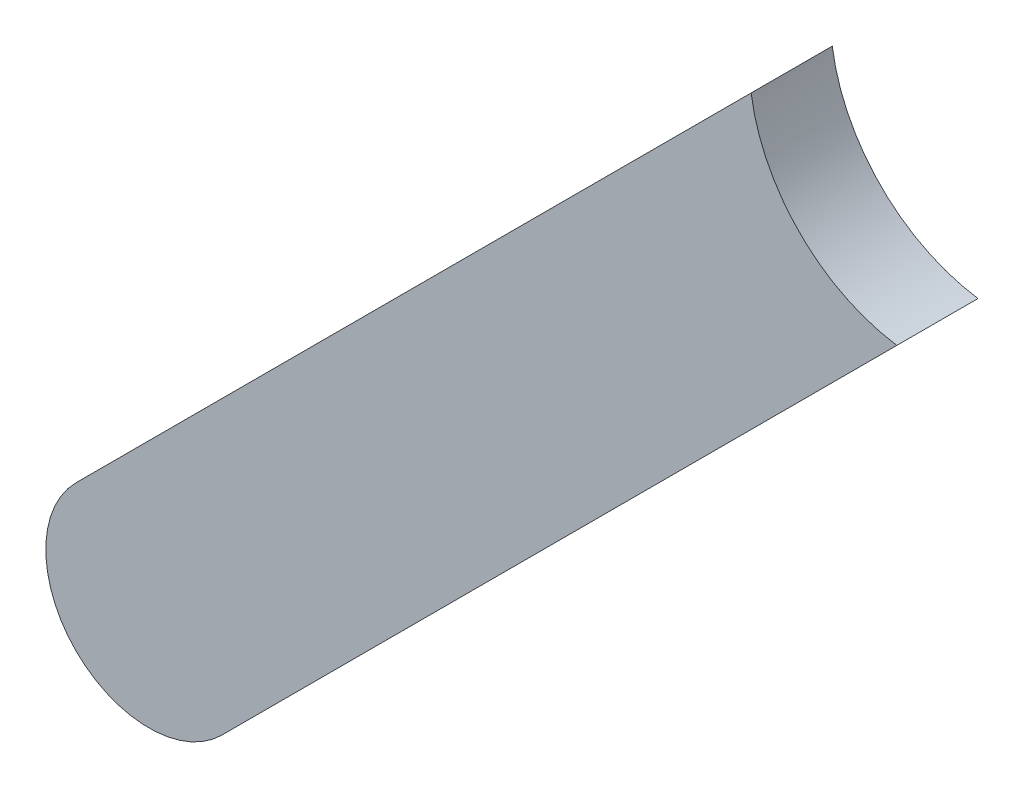
ISO-10303-21;
HEADER;
FILE_DESCRIPTION(('STEP AP214'),'2;1');
FILE_NAME('part.step','',(''),(''),'','','');
FILE_SCHEMA(('AUTOMOTIVE_DESIGN { 1 0 10303 214 1 1 1 1 }'));
ENDSEC;
DATA;
#1=APPLICATION_CONTEXT('core data for automotive mechanical design processes');
#2=APPLICATION_PROTOCOL_DEFINITION('international standard','automotive_design',2000,#1);
#3=PRODUCT_CONTEXT('',#1,'mechanical');
#4=PRODUCT('Part','Part','',(#3));
#5=PRODUCT_RELATED_PRODUCT_CATEGORY('part','',(#4));
#6=PRODUCT_DEFINITION_FORMATION('','',#4);
#7=PRODUCT_DEFINITION_CONTEXT('part definition',#1,'design');
#8=PRODUCT_DEFINITION('design','',#6,#7);
#9=PRODUCT_DEFINITION_SHAPE('','',#8);
#10=(LENGTH_UNIT() NAMED_UNIT(*) SI_UNIT(.MILLI.,.METRE.));
#11=(NAMED_UNIT(*) PLANE_ANGLE_UNIT() SI_UNIT($,.RADIAN.));
#12=(NAMED_UNIT(*) SI_UNIT($,.STERADIAN.) SOLID_ANGLE_UNIT());
#13=UNCERTAINTY_MEASURE_WITH_UNIT(LENGTH_MEASURE(1.E-05),#10,'distance_accuracy_value','');
#14=(GEOMETRIC_REPRESENTATION_CONTEXT(3) GLOBAL_UNCERTAINTY_ASSIGNED_CONTEXT((#13)) GLOBAL_UNIT_ASSIGNED_CONTEXT((#10,
#11,#12)) REPRESENTATION_CONTEXT('',''));
#15=CARTESIAN_POINT('',(0.,0.,0.));
#16=DIRECTION('',(0.,0.,1.));
#17=DIRECTION('',(1.,0.,0.));
#18=AXIS2_PLACEMENT_3D('',#15,#16,#17);
#19=CARTESIAN_POINT('',(137.97460594,62.72501806,0.));
#20=DIRECTION('',(-0.707106781186548,0.707106781186548,0.));
#21=DIRECTION('',(0.707106781186548,0.707106781186548,0.));
#22=AXIS2_PLACEMENT_3D('',#19,#20,#21);
#23=PLANE('',#22);
#24=DIRECTION('',(0.707106781186548,0.707106781186548,0.));
#25=VECTOR('',#24,1.);
#26=CARTESIAN_POINT('',(137.97460594,62.72501806,0.1999996));
#27=LINE('',#26,#25);
#28=CARTESIAN_POINT('',(137.97460594,62.72501806,0.1999996));
#29=VERTEX_POINT('',#28);
#30=CARTESIAN_POINT('',(139.63866116455,64.3890732845497,0.1999996));
#31=VERTEX_POINT('',#30);
#32=EDGE_CURVE('E11',#29,#31,#27,.T.);
#33=ORIENTED_EDGE('',*,*,#32,.F.);
#34=DIRECTION('',(0.,0.,1.));
#35=VECTOR('',#34,1.);
#36=CARTESIAN_POINT('',(137.97460594,62.72501806,0.));
#37=LINE('',#36,#35);
#38=CARTESIAN_POINT('',(137.97460594,62.72501806,0.));
#39=VERTEX_POINT('',#38);
#40=EDGE_CURVE('E24',#39,#29,#37,.T.);
#41=ORIENTED_EDGE('',*,*,#40,.F.);
#42=DIRECTION('',(0.707106781186548,0.707106781186548,0.));
#43=VECTOR('',#42,1.);
#44=CARTESIAN_POINT('',(137.97460594,62.72501806,0.));
#45=LINE('',#44,#43);
#46=CARTESIAN_POINT('',(139.63866116455,64.3890732845497,0.));
#47=VERTEX_POINT('',#46);
#48=EDGE_CURVE('E75',#39,#47,#45,.T.);
#49=ORIENTED_EDGE('',*,*,#48,.T.);
#50=DIRECTION('',(0.,0.,1.));
#51=VECTOR('',#50,1.);
#52=CARTESIAN_POINT('',(139.63866116455,64.3890732845497,0.));
#53=LINE('',#52,#51);
#54=EDGE_CURVE('E37',#47,#31,#53,.T.);
#55=ORIENTED_EDGE('',*,*,#54,.T.);
#56=EDGE_LOOP('',(#33,#41,#49,#55));
#57=FACE_BOUND('',#56,.T.);
#58=ADVANCED_FACE('F17',(#57),#23,.F.);
#59=CARTESIAN_POINT('',(139.7,64.809624,0.));
#60=DIRECTION('',(0.,0.,-1.));
#61=DIRECTION('',(1.,0.,0.));
#62=AXIS2_PLACEMENT_3D('',#59,#60,#61);
#63=CYLINDRICAL_SURFACE('',#62,0.42500042);
#64=DIRECTION('',(0.,0.,1.));
#65=VECTOR('',#64,1.);
#66=CARTESIAN_POINT('',(139.27944928455,64.7482851645497,0.));
#67=LINE('',#66,#65);
#68=CARTESIAN_POINT('',(139.27944928455,64.7482851645497,0.));
#69=VERTEX_POINT('',#68);
#70=CARTESIAN_POINT('',(139.27944928455,64.7482851645497,0.1999996));
#71=VERTEX_POINT('',#70);
#72=EDGE_CURVE('E67',#69,#71,#67,.T.);
#73=ORIENTED_EDGE('',*,*,#72,.T.);
#74=CARTESIAN_POINT('',(139.7,64.809624,0.1999996));
#75=DIRECTION('',(0.,0.,1.));
#76=DIRECTION('',(1.,0.,0.));
#77=AXIS2_PLACEMENT_3D('',#74,#75,#76);
#78=CIRCLE('',#77,0.42500042);
#79=EDGE_CURVE('E82',#71,#31,#78,.T.);
#80=ORIENTED_EDGE('',*,*,#79,.T.);
#81=ORIENTED_EDGE('',*,*,#54,.F.);
#82=CARTESIAN_POINT('',(139.7,64.809624,0.));
#83=DIRECTION('',(0.,0.,1.));
#84=DIRECTION('',(1.,0.,0.));
#85=AXIS2_PLACEMENT_3D('',#82,#83,#84);
#86=CIRCLE('',#85,0.42500042);
#87=EDGE_CURVE('E80',#69,#47,#86,.T.);
#88=ORIENTED_EDGE('',*,*,#87,.F.);
#89=EDGE_LOOP('',(#73,#80,#81,#88));
#90=FACE_BOUND('',#89,.T.);
#91=ADVANCED_FACE('F88',(#90),#63,.F.);
#92=CARTESIAN_POINT('',(139.27944928455,64.7482851645497,0.));
#93=DIRECTION('',(0.707106781186548,-0.707106781186548,0.));
#94=DIRECTION('',(-0.707106781186548,-0.707106781186548,0.));
#95=AXIS2_PLACEMENT_3D('',#92,#93,#94);
#96=PLANE('',#95);
#97=DIRECTION('',(-0.707106781186548,-0.707106781186548,0.));
#98=VECTOR('',#97,1.);
#99=CARTESIAN_POINT('',(139.52039406,64.98922994,0.1999996));
#100=LINE('',#99,#98);
#101=CARTESIAN_POINT('',(137.61539406,63.08422994,0.1999996));
#102=VERTEX_POINT('',#101);
#103=EDGE_CURVE('E71',#71,#102,#100,.T.);
#104=ORIENTED_EDGE('',*,*,#103,.F.);
#105=ORIENTED_EDGE('',*,*,#72,.F.);
#106=DIRECTION('',(-0.707106781186548,-0.707106781186548,0.));
#107=VECTOR('',#106,1.);
#108=CARTESIAN_POINT('',(139.52039406,64.98922994,0.));
#109=LINE('',#108,#107);
#110=CARTESIAN_POINT('',(137.61539406,63.08422994,0.));
#111=VERTEX_POINT('',#110);
#112=EDGE_CURVE('E63',#69,#111,#109,.T.);
#113=ORIENTED_EDGE('',*,*,#112,.T.);
#114=DIRECTION('',(0.,0.,1.));
#115=VECTOR('',#114,1.);
#116=CARTESIAN_POINT('',(137.61539406,63.08422994,0.));
#117=LINE('',#116,#115);
#118=EDGE_CURVE('E53',#111,#102,#117,.T.);
#119=ORIENTED_EDGE('',*,*,#118,.T.);
#120=EDGE_LOOP('',(#104,#105,#113,#119));
#121=FACE_BOUND('',#120,.T.);
#122=ADVANCED_FACE('F66',(#121),#96,.F.);
#123=CARTESIAN_POINT('',(137.795,62.904624,0.));
#124=DIRECTION('',(0.,0.,-1.));
#125=DIRECTION('',(-0.707106781186576,0.70710678118652,0.));
#126=AXIS2_PLACEMENT_3D('',#123,#124,#125);
#127=CYLINDRICAL_SURFACE('',#126,0.254001156230781);
#128=CARTESIAN_POINT('',(137.795,62.904624,0.1999996));
#129=DIRECTION('',(0.,0.,1.));
#130=DIRECTION('',(-0.707106781186576,0.70710678118652,0.));
#131=AXIS2_PLACEMENT_3D('',#128,#129,#130);
#132=CIRCLE('',#131,0.254001156230781);
#133=EDGE_CURVE('E59',#102,#29,#132,.T.);
#134=ORIENTED_EDGE('',*,*,#133,.F.);
#135=ORIENTED_EDGE('',*,*,#118,.F.);
#136=CARTESIAN_POINT('',(137.795,62.904624,0.));
#137=DIRECTION('',(0.,0.,1.));
#138=DIRECTION('',(-0.707106781186576,0.70710678118652,0.));
#139=AXIS2_PLACEMENT_3D('',#136,#137,#138);
#140=CIRCLE('',#139,0.254001156230781);
#141=EDGE_CURVE('E57',#111,#39,#140,.T.);
#142=ORIENTED_EDGE('',*,*,#141,.T.);
#143=ORIENTED_EDGE('',*,*,#40,.T.);
#144=EDGE_LOOP('',(#134,#135,#142,#143));
#145=FACE_BOUND('',#144,.T.);
#146=ADVANCED_FACE('F55',(#145),#127,.T.);
#147=CARTESIAN_POINT('',(137.97460594,62.72501806,0.));
#148=DIRECTION('',(0.,0.,-1.));
#149=DIRECTION('',(-1.,0.,0.));
#150=AXIS2_PLACEMENT_3D('',#147,#148,#149);
#151=PLANE('',#150);
#152=ORIENTED_EDGE('',*,*,#48,.F.);
#153=ORIENTED_EDGE('',*,*,#141,.F.);
#154=ORIENTED_EDGE('',*,*,#112,.F.);
#155=ORIENTED_EDGE('',*,*,#87,.T.);
#156=EDGE_LOOP('',(#152,#153,#154,#155));
#157=FACE_BOUND('',#156,.T.);
#158=ADVANCED_FACE('F74',(#157),#151,.T.);
#159=CARTESIAN_POINT('',(137.97460594,62.72501806,0.1999996));
#160=DIRECTION('',(0.,0.,-1.));
#161=DIRECTION('',(-1.,0.,0.));
#162=AXIS2_PLACEMENT_3D('',#159,#160,#161);
#163=PLANE('',#162);
#164=ORIENTED_EDGE('',*,*,#133,.T.);
#165=ORIENTED_EDGE('',*,*,#32,.T.);
#166=ORIENTED_EDGE('',*,*,#79,.F.);
#167=ORIENTED_EDGE('',*,*,#103,.T.);
#168=EDGE_LOOP('',(#164,#165,#166,#167));
#169=FACE_BOUND('',#168,.T.);
#170=ADVANCED_FACE('F91',(#169),#163,.F.);
#171=CLOSED_SHELL('',(#58,#91,#122,#146,#158,#170));
#172=MANIFOLD_SOLID_BREP('B1',#171);
#173=ADVANCED_BREP_SHAPE_REPRESENTATION('',(#18,#172),#14);
#174=SHAPE_DEFINITION_REPRESENTATION(#9,#173);
ENDSEC;
END-ISO-10303-21;
